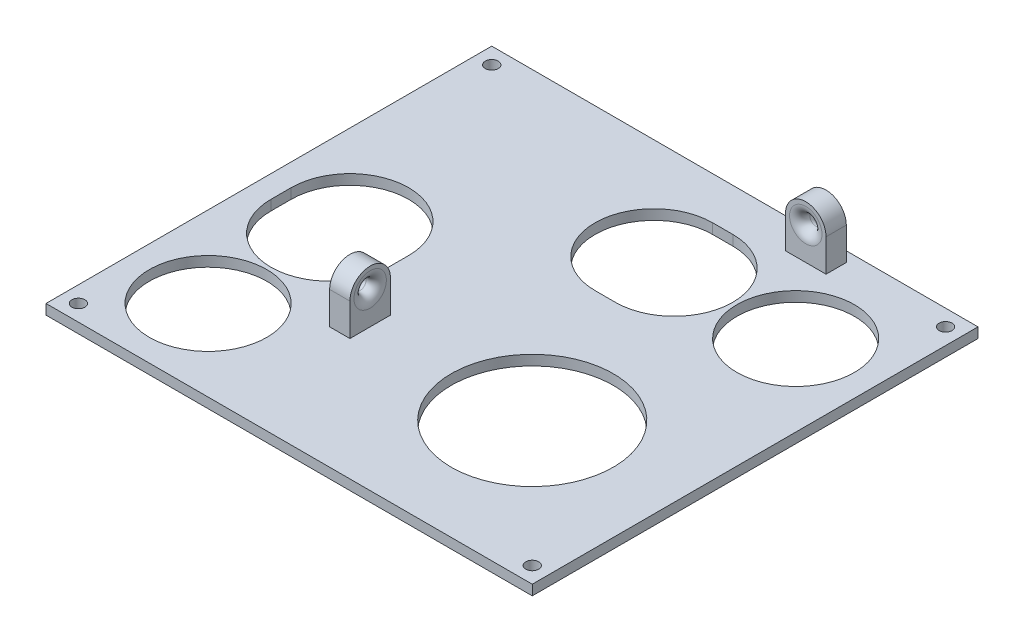
ISO-10303-21;
HEADER;
FILE_DESCRIPTION(('STEP AP214'),'2;1');
FILE_NAME('part.step','',(''),(''),'','','');
FILE_SCHEMA(('AUTOMOTIVE_DESIGN { 1 0 10303 214 1 1 1 1 }'));
ENDSEC;
DATA;
#1=APPLICATION_CONTEXT('core data for automotive mechanical design processes');
#2=APPLICATION_PROTOCOL_DEFINITION('international standard','automotive_design',2000,#1);
#3=PRODUCT_CONTEXT('',#1,'mechanical');
#4=PRODUCT('Part','Part','',(#3));
#5=PRODUCT_RELATED_PRODUCT_CATEGORY('part','',(#4));
#6=PRODUCT_DEFINITION_FORMATION('','',#4);
#7=PRODUCT_DEFINITION_CONTEXT('part definition',#1,'design');
#8=PRODUCT_DEFINITION('design','',#6,#7);
#9=PRODUCT_DEFINITION_SHAPE('','',#8);
#10=(LENGTH_UNIT() NAMED_UNIT(*) SI_UNIT(.MILLI.,.METRE.));
#11=(NAMED_UNIT(*) PLANE_ANGLE_UNIT() SI_UNIT($,.RADIAN.));
#12=(NAMED_UNIT(*) SI_UNIT($,.STERADIAN.) SOLID_ANGLE_UNIT());
#13=UNCERTAINTY_MEASURE_WITH_UNIT(LENGTH_MEASURE(1.E-05),#10,'distance_accuracy_value','');
#14=(GEOMETRIC_REPRESENTATION_CONTEXT(3) GLOBAL_UNCERTAINTY_ASSIGNED_CONTEXT((#13)) GLOBAL_UNIT_ASSIGNED_CONTEXT((#10,
#11,#12)) REPRESENTATION_CONTEXT('',''));
#15=CARTESIAN_POINT('',(0.,0.,0.));
#16=DIRECTION('',(0.,0.,1.));
#17=DIRECTION('',(1.,0.,0.));
#18=AXIS2_PLACEMENT_3D('',#15,#16,#17);
#19=CARTESIAN_POINT('',(-20.,16.5,15.));
#20=DIRECTION('',(0.,0.,1.));
#21=DIRECTION('',(1.,0.,0.));
#22=AXIS2_PLACEMENT_3D('',#19,#20,#21);
#23=PLANE('',#22);
#24=DIRECTION('',(1.,0.,0.));
#25=VECTOR('',#24,1.);
#26=CARTESIAN_POINT('',(-20.,10.5,15.));
#27=LINE('',#26,#25);
#28=CARTESIAN_POINT('',(-20.,10.5,15.));
#29=VERTEX_POINT('',#28);
#30=CARTESIAN_POINT('',(-15.,10.5,15.));
#31=VERTEX_POINT('',#30);
#32=EDGE_CURVE('E181',#29,#31,#27,.T.);
#33=ORIENTED_EDGE('',*,*,#32,.T.);
#34=DIRECTION('',(0.,-1.,0.));
#35=VECTOR('',#34,1.);
#36=CARTESIAN_POINT('',(-15.,16.5,15.));
#37=LINE('',#36,#35);
#38=CARTESIAN_POINT('',(-15.,2.5,15.));
#39=VERTEX_POINT('',#38);
#40=EDGE_CURVE('E204',#31,#39,#37,.T.);
#41=ORIENTED_EDGE('',*,*,#40,.T.);
#42=DIRECTION('',(-1.,0.,0.));
#43=VECTOR('',#42,1.);
#44=CARTESIAN_POINT('',(-20.,2.5,15.));
#45=LINE('',#44,#43);
#46=CARTESIAN_POINT('',(-20.,2.5,15.));
#47=VERTEX_POINT('',#46);
#48=EDGE_CURVE('E201',#39,#47,#45,.T.);
#49=ORIENTED_EDGE('',*,*,#48,.T.);
#50=DIRECTION('',(0.,-1.,0.));
#51=VECTOR('',#50,1.);
#52=CARTESIAN_POINT('',(-20.,16.5,15.));
#53=LINE('',#52,#51);
#54=EDGE_CURVE('E195',#29,#47,#53,.T.);
#55=ORIENTED_EDGE('',*,*,#54,.F.);
#56=EDGE_LOOP('',(#33,#41,#49,#55));
#57=FACE_BOUND('',#56,.T.);
#58=ADVANCED_FACE('F43',(#57),#23,.F.);
#59=CARTESIAN_POINT('',(30.,16.5,-52.5));
#60=DIRECTION('',(-1.,0.,0.));
#61=DIRECTION('',(0.,0.,1.));
#62=AXIS2_PLACEMENT_3D('',#59,#60,#61);
#63=PLANE('',#62);
#64=DIRECTION('',(0.,0.,1.));
#65=VECTOR('',#64,1.);
#66=CARTESIAN_POINT('',(30.,10.5,-55.));
#67=LINE('',#66,#65);
#68=CARTESIAN_POINT('',(30.,10.5,-52.5));
#69=VERTEX_POINT('',#68);
#70=CARTESIAN_POINT('',(30.,10.5,-47.5));
#71=VERTEX_POINT('',#70);
#72=EDGE_CURVE('E613',#69,#71,#67,.T.);
#73=ORIENTED_EDGE('',*,*,#72,.T.);
#74=DIRECTION('',(0.,-1.,0.));
#75=VECTOR('',#74,1.);
#76=CARTESIAN_POINT('',(30.,16.5,-47.5));
#77=LINE('',#76,#75);
#78=CARTESIAN_POINT('',(30.,2.5,-47.5));
#79=VERTEX_POINT('',#78);
#80=EDGE_CURVE('E551',#71,#79,#77,.T.);
#81=ORIENTED_EDGE('',*,*,#80,.T.);
#82=DIRECTION('',(0.,0.,-1.));
#83=VECTOR('',#82,1.);
#84=CARTESIAN_POINT('',(30.,2.5,-52.5));
#85=LINE('',#84,#83);
#86=CARTESIAN_POINT('',(30.,2.5,-52.5));
#87=VERTEX_POINT('',#86);
#88=EDGE_CURVE('E599',#79,#87,#85,.T.);
#89=ORIENTED_EDGE('',*,*,#88,.T.);
#90=DIRECTION('',(0.,-1.,0.));
#91=VECTOR('',#90,1.);
#92=CARTESIAN_POINT('',(30.,16.5,-52.5));
#93=LINE('',#92,#91);
#94=EDGE_CURVE('E572',#69,#87,#93,.T.);
#95=ORIENTED_EDGE('',*,*,#94,.F.);
#96=EDGE_LOOP('',(#73,#81,#89,#95));
#97=FACE_BOUND('',#96,.T.);
#98=ADVANCED_FACE('F436',(#97),#63,.F.);
#99=CARTESIAN_POINT('',(0.,2.5,0.));
#100=DIRECTION('',(0.,1.,0.));
#101=DIRECTION('',(0.,0.,1.));
#102=AXIS2_PLACEMENT_3D('',#99,#100,#101);
#103=PLANE('',#102);
#104=DIRECTION('',(0.,0.,1.));
#105=VECTOR('',#104,1.);
#106=CARTESIAN_POINT('',(-54.5,2.5,5.));
#107=LINE('',#106,#105);
#108=CARTESIAN_POINT('',(-54.5,2.5,0.));
#109=VERTEX_POINT('',#108);
#110=CARTESIAN_POINT('',(-54.5,2.5,5.));
#111=VERTEX_POINT('',#110);
#112=EDGE_CURVE('E224',#109,#111,#107,.T.);
#113=ORIENTED_EDGE('',*,*,#112,.F.);
#114=CARTESIAN_POINT('',(-40.,2.5,0.));
#115=DIRECTION('',(0.,1.,0.));
#116=DIRECTION('',(0.,0.,1.));
#117=AXIS2_PLACEMENT_3D('',#114,#115,#116);
#118=CIRCLE('',#117,14.5);
#119=CARTESIAN_POINT('',(-25.5,2.5,0.));
#120=VERTEX_POINT('',#119);
#121=EDGE_CURVE('E220',#120,#109,#118,.T.);
#122=ORIENTED_EDGE('',*,*,#121,.F.);
#123=DIRECTION('',(0.,0.,-1.));
#124=VECTOR('',#123,1.);
#125=CARTESIAN_POINT('',(-25.5,2.5,5.));
#126=LINE('',#125,#124);
#127=CARTESIAN_POINT('',(-25.5,2.5,5.));
#128=VERTEX_POINT('',#127);
#129=EDGE_CURVE('E216',#128,#120,#126,.T.);
#130=ORIENTED_EDGE('',*,*,#129,.F.);
#131=CARTESIAN_POINT('',(-40.,2.5,5.));
#132=DIRECTION('',(0.,1.,0.));
#133=DIRECTION('',(0.,0.,1.));
#134=AXIS2_PLACEMENT_3D('',#131,#132,#133);
#135=CIRCLE('',#134,14.5);
#136=EDGE_CURVE('E296',#111,#128,#135,.T.);
#137=ORIENTED_EDGE('',*,*,#136,.F.);
#138=EDGE_LOOP('',(#113,#122,#130,#137));
#139=FACE_BOUND('',#138,.T.);
#140=DIRECTION('',(1.,0.,0.));
#141=VECTOR('',#140,1.);
#142=CARTESIAN_POINT('',(10.,2.5,-15.5));
#143=LINE('',#142,#141);
#144=CARTESIAN_POINT('',(5.,2.5,-15.5));
#145=VERTEX_POINT('',#144);
#146=CARTESIAN_POINT('',(10.,2.5,-15.5));
#147=VERTEX_POINT('',#146);
#148=EDGE_CURVE('E241',#145,#147,#143,.T.);
#149=ORIENTED_EDGE('',*,*,#148,.F.);
#150=CARTESIAN_POINT('',(4.99999999999999,2.5,-30.));
#151=DIRECTION('',(0.,1.,0.));
#152=DIRECTION('',(0.,0.,1.));
#153=AXIS2_PLACEMENT_3D('',#150,#151,#152);
#154=CIRCLE('',#153,14.5);
#155=CARTESIAN_POINT('',(5.,2.5,-44.5));
#156=VERTEX_POINT('',#155);
#157=EDGE_CURVE('E237',#156,#145,#154,.T.);
#158=ORIENTED_EDGE('',*,*,#157,.F.);
#159=DIRECTION('',(-1.,0.,0.));
#160=VECTOR('',#159,1.);
#161=CARTESIAN_POINT('',(9.99999999999999,2.5,-44.5));
#162=LINE('',#161,#160);
#163=CARTESIAN_POINT('',(9.99999999999999,2.5,-44.5));
#164=VERTEX_POINT('',#163);
#165=EDGE_CURVE('E209',#164,#156,#162,.T.);
#166=ORIENTED_EDGE('',*,*,#165,.F.);
#167=CARTESIAN_POINT('',(9.99999999999999,2.5,-30.));
#168=DIRECTION('',(0.,1.,0.));
#169=DIRECTION('',(0.,0.,1.));
#170=AXIS2_PLACEMENT_3D('',#167,#168,#169);
#171=CIRCLE('',#170,14.5);
#172=EDGE_CURVE('E292',#147,#164,#171,.T.);
#173=ORIENTED_EDGE('',*,*,#172,.F.);
#174=EDGE_LOOP('',(#149,#158,#166,#173));
#175=FACE_BOUND('',#174,.T.);
#176=CARTESIAN_POINT('',(-56.,2.5,51.));
#177=DIRECTION('',(0.,1.,0.));
#178=DIRECTION('',(0.,0.,1.));
#179=AXIS2_PLACEMENT_3D('',#176,#177,#178);
#180=CIRCLE('',#179,1.60000000000001);
#181=CARTESIAN_POINT('',(-56.,2.5,52.6));
#182=VERTEX_POINT('',#181);
#183=EDGE_CURVE('E264',#182,#182,#180,.T.);
#184=ORIENTED_EDGE('',*,*,#183,.F.);
#185=EDGE_LOOP('',(#184));
#186=FACE_BOUND('',#185,.T.);
#187=CARTESIAN_POINT('',(56.,2.5,51.));
#188=DIRECTION('',(0.,1.,0.));
#189=DIRECTION('',(0.,0.,1.));
#190=AXIS2_PLACEMENT_3D('',#187,#188,#189);
#191=CIRCLE('',#190,1.60000000000001);
#192=CARTESIAN_POINT('',(56.,2.5,52.6));
#193=VERTEX_POINT('',#192);
#194=EDGE_CURVE('E270',#193,#193,#191,.T.);
#195=ORIENTED_EDGE('',*,*,#194,.F.);
#196=EDGE_LOOP('',(#195));
#197=FACE_BOUND('',#196,.T.);
#198=CARTESIAN_POINT('',(56.,2.5,-51.));
#199=DIRECTION('',(0.,1.,0.));
#200=DIRECTION('',(0.,0.,1.));
#201=AXIS2_PLACEMENT_3D('',#198,#199,#200);
#202=CIRCLE('',#201,1.60000000000001);
#203=CARTESIAN_POINT('',(56.,2.5,-49.4));
#204=VERTEX_POINT('',#203);
#205=EDGE_CURVE('E265',#204,#204,#202,.T.);
#206=ORIENTED_EDGE('',*,*,#205,.F.);
#207=EDGE_LOOP('',(#206));
#208=FACE_BOUND('',#207,.T.);
#209=CARTESIAN_POINT('',(-56.,2.5,-51.));
#210=DIRECTION('',(0.,1.,0.));
#211=DIRECTION('',(0.,0.,1.));
#212=AXIS2_PLACEMENT_3D('',#209,#210,#211);
#213=CIRCLE('',#212,1.60000000000001);
#214=CARTESIAN_POINT('',(-56.,2.5,-49.4));
#215=VERTEX_POINT('',#214);
#216=EDGE_CURVE('E269',#215,#215,#213,.T.);
#217=ORIENTED_EDGE('',*,*,#216,.F.);
#218=EDGE_LOOP('',(#217));
#219=FACE_BOUND('',#218,.T.);
#220=CARTESIAN_POINT('',(25.,2.5,20.));
#221=DIRECTION('',(0.,1.,0.));
#222=DIRECTION('',(0.,0.,1.));
#223=AXIS2_PLACEMENT_3D('',#220,#221,#222);
#224=CIRCLE('',#223,20.);
#225=CARTESIAN_POINT('',(25.,2.5,40.));
#226=VERTEX_POINT('',#225);
#227=EDGE_CURVE('E281',#226,#226,#224,.T.);
#228=ORIENTED_EDGE('',*,*,#227,.F.);
#229=EDGE_LOOP('',(#228));
#230=FACE_BOUND('',#229,.T.);
#231=CARTESIAN_POINT('',(40.,2.5,-30.));
#232=DIRECTION('',(0.,1.,0.));
#233=DIRECTION('',(0.,0.,1.));
#234=AXIS2_PLACEMENT_3D('',#231,#232,#233);
#235=CIRCLE('',#234,14.5);
#236=CARTESIAN_POINT('',(40.,2.5,-15.5));
#237=VERTEX_POINT('',#236);
#238=EDGE_CURVE('E287',#237,#237,#235,.T.);
#239=ORIENTED_EDGE('',*,*,#238,.F.);
#240=EDGE_LOOP('',(#239));
#241=FACE_BOUND('',#240,.T.);
#242=CARTESIAN_POINT('',(-40.,2.5,35.));
#243=DIRECTION('',(0.,1.,0.));
#244=DIRECTION('',(0.,0.,1.));
#245=AXIS2_PLACEMENT_3D('',#242,#243,#244);
#246=CIRCLE('',#245,14.5);
#247=CARTESIAN_POINT('',(-40.,2.5,49.5));
#248=VERTEX_POINT('',#247);
#249=EDGE_CURVE('E300',#248,#248,#246,.T.);
#250=ORIENTED_EDGE('',*,*,#249,.F.);
#251=EDGE_LOOP('',(#250));
#252=FACE_BOUND('',#251,.T.);
#253=DIRECTION('',(0.,0.,-1.));
#254=VECTOR('',#253,1.);
#255=CARTESIAN_POINT('',(60.,2.5,-55.));
#256=LINE('',#255,#254);
#257=CARTESIAN_POINT('',(60.,2.5,55.));
#258=VERTEX_POINT('',#257);
#259=CARTESIAN_POINT('',(60.,2.5,-55.));
#260=VERTEX_POINT('',#259);
#261=EDGE_CURVE('E304',#258,#260,#256,.T.);
#262=ORIENTED_EDGE('',*,*,#261,.T.);
#263=DIRECTION('',(-1.,0.,0.));
#264=VECTOR('',#263,1.);
#265=CARTESIAN_POINT('',(-60.,2.5,-55.));
#266=LINE('',#265,#264);
#267=CARTESIAN_POINT('',(-60.,2.5,-55.));
#268=VERTEX_POINT('',#267);
#269=EDGE_CURVE('E308',#260,#268,#266,.T.);
#270=ORIENTED_EDGE('',*,*,#269,.T.);
#271=DIRECTION('',(0.,0.,1.));
#272=VECTOR('',#271,1.);
#273=CARTESIAN_POINT('',(-60.,2.5,-55.));
#274=LINE('',#273,#272);
#275=CARTESIAN_POINT('',(-60.,2.5,55.));
#276=VERTEX_POINT('',#275);
#277=EDGE_CURVE('E312',#268,#276,#274,.T.);
#278=ORIENTED_EDGE('',*,*,#277,.T.);
#279=DIRECTION('',(1.,0.,0.));
#280=VECTOR('',#279,1.);
#281=CARTESIAN_POINT('',(-60.,2.5,55.));
#282=LINE('',#281,#280);
#283=EDGE_CURVE('E315',#276,#258,#282,.T.);
#284=ORIENTED_EDGE('',*,*,#283,.T.);
#285=EDGE_LOOP('',(#262,#270,#278,#284));
#286=FACE_BOUND('',#285,.T.);
#287=ORIENTED_EDGE('',*,*,#48,.F.);
#288=DIRECTION('',(0.,0.,-1.));
#289=VECTOR('',#288,1.);
#290=CARTESIAN_POINT('',(-15.,2.5,15.));
#291=LINE('',#290,#289);
#292=CARTESIAN_POINT('',(-15.,2.5,25.));
#293=VERTEX_POINT('',#292);
#294=EDGE_CURVE('E575',#293,#39,#291,.T.);
#295=ORIENTED_EDGE('',*,*,#294,.F.);
#296=DIRECTION('',(1.,0.,0.));
#297=VECTOR('',#296,1.);
#298=CARTESIAN_POINT('',(-20.,2.5,25.));
#299=LINE('',#298,#297);
#300=CARTESIAN_POINT('',(-20.,2.5,25.));
#301=VERTEX_POINT('',#300);
#302=EDGE_CURVE('E583',#301,#293,#299,.T.);
#303=ORIENTED_EDGE('',*,*,#302,.F.);
#304=DIRECTION('',(0.,0.,1.));
#305=VECTOR('',#304,1.);
#306=CARTESIAN_POINT('',(-20.,2.5,15.));
#307=LINE('',#306,#305);
#308=EDGE_CURVE('E580',#47,#301,#307,.T.);
#309=ORIENTED_EDGE('',*,*,#308,.F.);
#310=EDGE_LOOP('',(#287,#295,#303,#309));
#311=FACE_BOUND('',#310,.T.);
#312=DIRECTION('',(-1.,0.,0.));
#313=VECTOR('',#312,1.);
#314=CARTESIAN_POINT('',(20.,2.5,-52.5));
#315=LINE('',#314,#313);
#316=CARTESIAN_POINT('',(20.,2.5,-52.5));
#317=VERTEX_POINT('',#316);
#318=EDGE_CURVE('E598',#87,#317,#315,.T.);
#319=ORIENTED_EDGE('',*,*,#318,.F.);
#320=ORIENTED_EDGE('',*,*,#88,.F.);
#321=DIRECTION('',(1.,0.,0.));
#322=VECTOR('',#321,1.);
#323=CARTESIAN_POINT('',(20.,2.5,-47.5));
#324=LINE('',#323,#322);
#325=CARTESIAN_POINT('',(20.,2.5,-47.5));
#326=VERTEX_POINT('',#325);
#327=EDGE_CURVE('E555',#326,#79,#324,.T.);
#328=ORIENTED_EDGE('',*,*,#327,.F.);
#329=DIRECTION('',(0.,0.,1.));
#330=VECTOR('',#329,1.);
#331=CARTESIAN_POINT('',(20.,2.5,-52.5));
#332=LINE('',#331,#330);
#333=EDGE_CURVE('E567',#317,#326,#332,.T.);
#334=ORIENTED_EDGE('',*,*,#333,.F.);
#335=EDGE_LOOP('',(#319,#320,#328,#334));
#336=FACE_BOUND('',#335,.T.);
#337=ADVANCED_FACE('F441',(#139,#175,#186,#197,#208,#219,#230,#241,#252,#286,#311,#336),#103,.T.);
#338=CARTESIAN_POINT('',(-40.,-1.5,5.));
#339=DIRECTION('',(0.,1.,0.));
#340=DIRECTION('',(0.,0.,1.));
#341=AXIS2_PLACEMENT_3D('',#338,#339,#340);
#342=CYLINDRICAL_SURFACE('',#341,14.5);
#343=DIRECTION('',(0.,1.,0.));
#344=VECTOR('',#343,1.);
#345=CARTESIAN_POINT('',(-54.5,-1.5,5.));
#346=LINE('',#345,#344);
#347=CARTESIAN_POINT('',(-54.5,0.,5.));
#348=VERTEX_POINT('',#347);
#349=EDGE_CURVE('E389',#111,#348,#346,.F.);
#350=ORIENTED_EDGE('',*,*,#349,.F.);
#351=ORIENTED_EDGE('',*,*,#136,.T.);
#352=DIRECTION('',(0.,1.,0.));
#353=VECTOR('',#352,1.);
#354=CARTESIAN_POINT('',(-25.5,-1.5,5.));
#355=LINE('',#354,#353);
#356=CARTESIAN_POINT('',(-25.5,0.,5.));
#357=VERTEX_POINT('',#356);
#358=EDGE_CURVE('E385',#128,#357,#355,.F.);
#359=ORIENTED_EDGE('',*,*,#358,.T.);
#360=CARTESIAN_POINT('',(-40.,0.,5.));
#361=DIRECTION('',(0.,1.,0.));
#362=DIRECTION('',(0.,0.,1.));
#363=AXIS2_PLACEMENT_3D('',#360,#361,#362);
#364=CIRCLE('',#363,14.5);
#365=EDGE_CURVE('E351',#348,#357,#364,.T.);
#366=ORIENTED_EDGE('',*,*,#365,.F.);
#367=EDGE_LOOP('',(#350,#351,#359,#366));
#368=FACE_BOUND('',#367,.T.);
#369=ADVANCED_FACE('F504',(#368),#342,.F.);
#370=CARTESIAN_POINT('',(9.99999999999999,-1.5,-30.));
#371=DIRECTION('',(0.,1.,0.));
#372=DIRECTION('',(0.,0.,1.));
#373=AXIS2_PLACEMENT_3D('',#370,#371,#372);
#374=CYLINDRICAL_SURFACE('',#373,14.5);
#375=DIRECTION('',(0.,1.,0.));
#376=VECTOR('',#375,1.);
#377=CARTESIAN_POINT('',(9.99999999999999,-1.5,-15.5));
#378=LINE('',#377,#376);
#379=CARTESIAN_POINT('',(10.,0.,-15.5));
#380=VERTEX_POINT('',#379);
#381=EDGE_CURVE('E382',#147,#380,#378,.F.);
#382=ORIENTED_EDGE('',*,*,#381,.F.);
#383=ORIENTED_EDGE('',*,*,#172,.T.);
#384=DIRECTION('',(0.,1.,0.));
#385=VECTOR('',#384,1.);
#386=CARTESIAN_POINT('',(9.99999999999999,-1.5,-44.5));
#387=LINE('',#386,#385);
#388=CARTESIAN_POINT('',(9.99999999999999,0.,-44.5));
#389=VERTEX_POINT('',#388);
#390=EDGE_CURVE('E347',#164,#389,#387,.F.);
#391=ORIENTED_EDGE('',*,*,#390,.T.);
#392=CARTESIAN_POINT('',(9.99999999999999,0.,-30.));
#393=DIRECTION('',(0.,1.,0.));
#394=DIRECTION('',(0.,0.,1.));
#395=AXIS2_PLACEMENT_3D('',#392,#393,#394);
#396=CIRCLE('',#395,14.5);
#397=EDGE_CURVE('E355',#380,#389,#396,.T.);
#398=ORIENTED_EDGE('',*,*,#397,.F.);
#399=EDGE_LOOP('',(#382,#383,#391,#398));
#400=FACE_BOUND('',#399,.T.);
#401=ADVANCED_FACE('F500',(#400),#374,.F.);
#402=CARTESIAN_POINT('',(60.,2.5,-55.));
#403=DIRECTION('',(-1.,0.,0.));
#404=DIRECTION('',(0.,0.,1.));
#405=AXIS2_PLACEMENT_3D('',#402,#403,#404);
#406=PLANE('',#405);
#407=DIRECTION('',(0.,0.,-1.));
#408=VECTOR('',#407,1.);
#409=CARTESIAN_POINT('',(60.,0.,-55.));
#410=LINE('',#409,#408);
#411=CARTESIAN_POINT('',(60.,0.,55.));
#412=VERTEX_POINT('',#411);
#413=CARTESIAN_POINT('',(60.,0.,-55.));
#414=VERTEX_POINT('',#413);
#415=EDGE_CURVE('E319',#412,#414,#410,.T.);
#416=ORIENTED_EDGE('',*,*,#415,.T.);
#417=DIRECTION('',(0.,-1.,0.));
#418=VECTOR('',#417,1.);
#419=CARTESIAN_POINT('',(60.,2.5,-55.));
#420=LINE('',#419,#418);
#421=EDGE_CURVE('E343',#260,#414,#420,.T.);
#422=ORIENTED_EDGE('',*,*,#421,.F.);
#423=ORIENTED_EDGE('',*,*,#261,.F.);
#424=DIRECTION('',(0.,-1.,0.));
#425=VECTOR('',#424,1.);
#426=CARTESIAN_POINT('',(60.,2.5,55.));
#427=LINE('',#426,#425);
#428=EDGE_CURVE('E318',#258,#412,#427,.T.);
#429=ORIENTED_EDGE('',*,*,#428,.T.);
#430=EDGE_LOOP('',(#416,#422,#423,#429));
#431=FACE_BOUND('',#430,.T.);
#432=ADVANCED_FACE('F503',(#431),#406,.F.);
#433=CARTESIAN_POINT('',(-60.,2.5,-55.));
#434=DIRECTION('',(0.,0.,1.));
#435=DIRECTION('',(1.,0.,0.));
#436=AXIS2_PLACEMENT_3D('',#433,#434,#435);
#437=PLANE('',#436);
#438=DIRECTION('',(-1.,0.,0.));
#439=VECTOR('',#438,1.);
#440=CARTESIAN_POINT('',(-60.,0.,-55.));
#441=LINE('',#440,#439);
#442=CARTESIAN_POINT('',(-60.,0.,-55.));
#443=VERTEX_POINT('',#442);
#444=EDGE_CURVE('E323',#414,#443,#441,.T.);
#445=ORIENTED_EDGE('',*,*,#444,.T.);
#446=DIRECTION('',(0.,-1.,0.));
#447=VECTOR('',#446,1.);
#448=CARTESIAN_POINT('',(-60.,2.5,-55.));
#449=LINE('',#448,#447);
#450=EDGE_CURVE('E339',#268,#443,#449,.T.);
#451=ORIENTED_EDGE('',*,*,#450,.F.);
#452=ORIENTED_EDGE('',*,*,#269,.F.);
#453=ORIENTED_EDGE('',*,*,#421,.T.);
#454=EDGE_LOOP('',(#445,#451,#452,#453));
#455=FACE_BOUND('',#454,.T.);
#456=ADVANCED_FACE('F526',(#455),#437,.F.);
#457=CARTESIAN_POINT('',(-60.,2.5,-55.));
#458=DIRECTION('',(1.,0.,0.));
#459=DIRECTION('',(0.,0.,-1.));
#460=AXIS2_PLACEMENT_3D('',#457,#458,#459);
#461=PLANE('',#460);
#462=DIRECTION('',(0.,0.,1.));
#463=VECTOR('',#462,1.);
#464=CARTESIAN_POINT('',(-60.,0.,-55.));
#465=LINE('',#464,#463);
#466=CARTESIAN_POINT('',(-60.,0.,55.));
#467=VERTEX_POINT('',#466);
#468=EDGE_CURVE('E327',#443,#467,#465,.T.);
#469=ORIENTED_EDGE('',*,*,#468,.T.);
#470=DIRECTION('',(0.,-1.,0.));
#471=VECTOR('',#470,1.);
#472=CARTESIAN_POINT('',(-60.,2.5,55.));
#473=LINE('',#472,#471);
#474=EDGE_CURVE('E335',#276,#467,#473,.T.);
#475=ORIENTED_EDGE('',*,*,#474,.F.);
#476=ORIENTED_EDGE('',*,*,#277,.F.);
#477=ORIENTED_EDGE('',*,*,#450,.T.);
#478=EDGE_LOOP('',(#469,#475,#476,#477));
#479=FACE_BOUND('',#478,.T.);
#480=ADVANCED_FACE('F522',(#479),#461,.F.);
#481=CARTESIAN_POINT('',(-60.,2.5,55.));
#482=DIRECTION('',(0.,0.,-1.));
#483=DIRECTION('',(-1.,0.,0.));
#484=AXIS2_PLACEMENT_3D('',#481,#482,#483);
#485=PLANE('',#484);
#486=DIRECTION('',(1.,0.,0.));
#487=VECTOR('',#486,1.);
#488=CARTESIAN_POINT('',(-60.,0.,55.));
#489=LINE('',#488,#487);
#490=EDGE_CURVE('E309',#467,#412,#489,.T.);
#491=ORIENTED_EDGE('',*,*,#490,.T.);
#492=ORIENTED_EDGE('',*,*,#428,.F.);
#493=ORIENTED_EDGE('',*,*,#283,.F.);
#494=ORIENTED_EDGE('',*,*,#474,.T.);
#495=EDGE_LOOP('',(#491,#492,#493,#494));
#496=FACE_BOUND('',#495,.T.);
#497=ADVANCED_FACE('F518',(#496),#485,.F.);
#498=CARTESIAN_POINT('',(0.,0.,0.));
#499=DIRECTION('',(0.,1.,0.));
#500=DIRECTION('',(0.,0.,1.));
#501=AXIS2_PLACEMENT_3D('',#498,#499,#500);
#502=PLANE('',#501);
#503=CARTESIAN_POINT('',(-56.,0.,51.));
#504=DIRECTION('',(0.,1.,0.));
#505=DIRECTION('',(0.,0.,1.));
#506=AXIS2_PLACEMENT_3D('',#503,#504,#505);
#507=CIRCLE('',#506,1.60000000000001);
#508=CARTESIAN_POINT('',(-56.,0.,52.6));
#509=VERTEX_POINT('',#508);
#510=EDGE_CURVE('E286',#509,#509,#507,.T.);
#511=ORIENTED_EDGE('',*,*,#510,.T.);
#512=EDGE_LOOP('',(#511));
#513=FACE_BOUND('',#512,.T.);
#514=CARTESIAN_POINT('',(56.,0.,51.));
#515=DIRECTION('',(0.,1.,0.));
#516=DIRECTION('',(0.,0.,1.));
#517=AXIS2_PLACEMENT_3D('',#514,#515,#516);
#518=CIRCLE('',#517,1.60000000000001);
#519=CARTESIAN_POINT('',(56.,0.,52.6));
#520=VERTEX_POINT('',#519);
#521=EDGE_CURVE('E372',#520,#520,#518,.T.);
#522=ORIENTED_EDGE('',*,*,#521,.T.);
#523=EDGE_LOOP('',(#522));
#524=FACE_BOUND('',#523,.T.);
#525=CARTESIAN_POINT('',(56.,0.,-51.));
#526=DIRECTION('',(0.,1.,0.));
#527=DIRECTION('',(0.,0.,1.));
#528=AXIS2_PLACEMENT_3D('',#525,#526,#527);
#529=CIRCLE('',#528,1.60000000000001);
#530=CARTESIAN_POINT('',(56.,0.,-49.4));
#531=VERTEX_POINT('',#530);
#532=EDGE_CURVE('E368',#531,#531,#529,.T.);
#533=ORIENTED_EDGE('',*,*,#532,.T.);
#534=EDGE_LOOP('',(#533));
#535=FACE_BOUND('',#534,.T.);
#536=CARTESIAN_POINT('',(-56.,0.,-51.));
#537=DIRECTION('',(0.,1.,0.));
#538=DIRECTION('',(0.,0.,1.));
#539=AXIS2_PLACEMENT_3D('',#536,#537,#538);
#540=CIRCLE('',#539,1.60000000000001);
#541=CARTESIAN_POINT('',(-56.,0.,-49.4));
#542=VERTEX_POINT('',#541);
#543=EDGE_CURVE('E280',#542,#542,#540,.T.);
#544=ORIENTED_EDGE('',*,*,#543,.T.);
#545=EDGE_LOOP('',(#544));
#546=FACE_BOUND('',#545,.T.);
#547=CARTESIAN_POINT('',(25.,0.,20.));
#548=DIRECTION('',(0.,1.,0.));
#549=DIRECTION('',(0.,0.,1.));
#550=AXIS2_PLACEMENT_3D('',#547,#548,#549);
#551=CIRCLE('',#550,20.);
#552=CARTESIAN_POINT('',(25.,0.,40.));
#553=VERTEX_POINT('',#552);
#554=EDGE_CURVE('E285',#553,#553,#551,.T.);
#555=ORIENTED_EDGE('',*,*,#554,.T.);
#556=EDGE_LOOP('',(#555));
#557=FACE_BOUND('',#556,.T.);
#558=CARTESIAN_POINT('',(40.,0.,-30.));
#559=DIRECTION('',(0.,1.,0.));
#560=DIRECTION('',(0.,0.,1.));
#561=AXIS2_PLACEMENT_3D('',#558,#559,#560);
#562=CIRCLE('',#561,14.5);
#563=CARTESIAN_POINT('',(40.,0.,-15.5));
#564=VERTEX_POINT('',#563);
#565=EDGE_CURVE('E324',#564,#564,#562,.T.);
#566=ORIENTED_EDGE('',*,*,#565,.T.);
#567=EDGE_LOOP('',(#566));
#568=FACE_BOUND('',#567,.T.);
#569=CARTESIAN_POINT('',(4.99999999999999,0.,-30.));
#570=DIRECTION('',(0.,1.,0.));
#571=DIRECTION('',(0.,0.,1.));
#572=AXIS2_PLACEMENT_3D('',#569,#570,#571);
#573=CIRCLE('',#572,14.5);
#574=CARTESIAN_POINT('',(5.,0.,-44.5));
#575=VERTEX_POINT('',#574);
#576=CARTESIAN_POINT('',(5.,0.,-15.5));
#577=VERTEX_POINT('',#576);
#578=EDGE_CURVE('E392',#575,#577,#573,.T.);
#579=ORIENTED_EDGE('',*,*,#578,.T.);
#580=DIRECTION('',(1.,0.,0.));
#581=VECTOR('',#580,1.);
#582=CARTESIAN_POINT('',(0.,0.,-15.5));
#583=LINE('',#582,#581);
#584=EDGE_CURVE('E252',#577,#380,#583,.T.);
#585=ORIENTED_EDGE('',*,*,#584,.T.);
#586=ORIENTED_EDGE('',*,*,#397,.T.);
#587=DIRECTION('',(-1.,0.,0.));
#588=VECTOR('',#587,1.);
#589=CARTESIAN_POINT('',(0.,0.,-44.5));
#590=LINE('',#589,#588);
#591=EDGE_CURVE('E231',#389,#575,#590,.T.);
#592=ORIENTED_EDGE('',*,*,#591,.T.);
#593=EDGE_LOOP('',(#579,#585,#586,#592));
#594=FACE_BOUND('',#593,.T.);
#595=CARTESIAN_POINT('',(-40.,0.,0.));
#596=DIRECTION('',(0.,1.,0.));
#597=DIRECTION('',(0.,0.,1.));
#598=AXIS2_PLACEMENT_3D('',#595,#596,#597);
#599=CIRCLE('',#598,14.5);
#600=CARTESIAN_POINT('',(-25.5,0.,0.));
#601=VERTEX_POINT('',#600);
#602=CARTESIAN_POINT('',(-54.5,0.,0.));
#603=VERTEX_POINT('',#602);
#604=EDGE_CURVE('E396',#601,#603,#599,.T.);
#605=ORIENTED_EDGE('',*,*,#604,.T.);
#606=DIRECTION('',(0.,0.,1.));
#607=VECTOR('',#606,1.);
#608=CARTESIAN_POINT('',(-54.5,0.,0.));
#609=LINE('',#608,#607);
#610=EDGE_CURVE('E260',#603,#348,#609,.T.);
#611=ORIENTED_EDGE('',*,*,#610,.T.);
#612=ORIENTED_EDGE('',*,*,#365,.T.);
#613=DIRECTION('',(0.,0.,-1.));
#614=VECTOR('',#613,1.);
#615=CARTESIAN_POINT('',(-25.5,0.,0.));
#616=LINE('',#615,#614);
#617=EDGE_CURVE('E256',#357,#601,#616,.T.);
#618=ORIENTED_EDGE('',*,*,#617,.T.);
#619=EDGE_LOOP('',(#605,#611,#612,#618));
#620=FACE_BOUND('',#619,.T.);
#621=CARTESIAN_POINT('',(-40.,0.,35.));
#622=DIRECTION('',(0.,1.,0.));
#623=DIRECTION('',(0.,0.,1.));
#624=AXIS2_PLACEMENT_3D('',#621,#622,#623);
#625=CIRCLE('',#624,14.5);
#626=CARTESIAN_POINT('',(-40.,0.,49.5));
#627=VERTEX_POINT('',#626);
#628=EDGE_CURVE('E291',#627,#627,#625,.T.);
#629=ORIENTED_EDGE('',*,*,#628,.T.);
#630=EDGE_LOOP('',(#629));
#631=FACE_BOUND('',#630,.T.);
#632=ORIENTED_EDGE('',*,*,#415,.F.);
#633=ORIENTED_EDGE('',*,*,#490,.F.);
#634=ORIENTED_EDGE('',*,*,#468,.F.);
#635=ORIENTED_EDGE('',*,*,#444,.F.);
#636=EDGE_LOOP('',(#632,#633,#634,#635));
#637=FACE_BOUND('',#636,.T.);
#638=ADVANCED_FACE('F511',(#513,#524,#535,#546,#557,#568,#594,#620,#631,#637),#502,.F.);
#639=CARTESIAN_POINT('',(-40.,-1.5,35.));
#640=DIRECTION('',(0.,1.,0.));
#641=DIRECTION('',(0.,0.,1.));
#642=AXIS2_PLACEMENT_3D('',#639,#640,#641);
#643=CYLINDRICAL_SURFACE('',#642,14.5);
#644=ORIENTED_EDGE('',*,*,#249,.T.);
#645=EDGE_LOOP('',(#644));
#646=FACE_BOUND('',#645,.T.);
#647=ORIENTED_EDGE('',*,*,#628,.F.);
#648=EDGE_LOOP('',(#647));
#649=FACE_BOUND('',#648,.T.);
#650=ADVANCED_FACE('F498',(#646,#649),#643,.F.);
#651=CARTESIAN_POINT('',(40.,-1.5,-30.));
#652=DIRECTION('',(0.,1.,0.));
#653=DIRECTION('',(0.,0.,1.));
#654=AXIS2_PLACEMENT_3D('',#651,#652,#653);
#655=CYLINDRICAL_SURFACE('',#654,14.5);
#656=ORIENTED_EDGE('',*,*,#238,.T.);
#657=EDGE_LOOP('',(#656));
#658=FACE_BOUND('',#657,.T.);
#659=ORIENTED_EDGE('',*,*,#565,.F.);
#660=EDGE_LOOP('',(#659));
#661=FACE_BOUND('',#660,.T.);
#662=ADVANCED_FACE('F494',(#658,#661),#655,.F.);
#663=CARTESIAN_POINT('',(25.,-7.5,20.));
#664=DIRECTION('',(0.,1.,0.));
#665=DIRECTION('',(0.,0.,1.));
#666=AXIS2_PLACEMENT_3D('',#663,#664,#665);
#667=CYLINDRICAL_SURFACE('',#666,20.);
#668=ORIENTED_EDGE('',*,*,#227,.T.);
#669=EDGE_LOOP('',(#668));
#670=FACE_BOUND('',#669,.T.);
#671=ORIENTED_EDGE('',*,*,#554,.F.);
#672=EDGE_LOOP('',(#671));
#673=FACE_BOUND('',#672,.T.);
#674=ADVANCED_FACE('F490',(#670,#673),#667,.F.);
#675=CARTESIAN_POINT('',(-56.,-7.5,-51.));
#676=DIRECTION('',(0.,1.,0.));
#677=DIRECTION('',(0.,0.,1.));
#678=AXIS2_PLACEMENT_3D('',#675,#676,#677);
#679=CYLINDRICAL_SURFACE('',#678,1.60000000000001);
#680=ORIENTED_EDGE('',*,*,#216,.T.);
#681=EDGE_LOOP('',(#680));
#682=FACE_BOUND('',#681,.T.);
#683=ORIENTED_EDGE('',*,*,#543,.F.);
#684=EDGE_LOOP('',(#683));
#685=FACE_BOUND('',#684,.T.);
#686=ADVANCED_FACE('F480',(#682,#685),#679,.F.);
#687=CARTESIAN_POINT('',(56.,-7.5,-51.));
#688=DIRECTION('',(0.,1.,0.));
#689=DIRECTION('',(0.,0.,1.));
#690=AXIS2_PLACEMENT_3D('',#687,#688,#689);
#691=CYLINDRICAL_SURFACE('',#690,1.60000000000001);
#692=ORIENTED_EDGE('',*,*,#205,.T.);
#693=EDGE_LOOP('',(#692));
#694=FACE_BOUND('',#693,.T.);
#695=ORIENTED_EDGE('',*,*,#532,.F.);
#696=EDGE_LOOP('',(#695));
#697=FACE_BOUND('',#696,.T.);
#698=ADVANCED_FACE('F476',(#694,#697),#691,.F.);
#699=CARTESIAN_POINT('',(56.,-7.5,51.));
#700=DIRECTION('',(0.,1.,0.));
#701=DIRECTION('',(0.,0.,1.));
#702=AXIS2_PLACEMENT_3D('',#699,#700,#701);
#703=CYLINDRICAL_SURFACE('',#702,1.60000000000001);
#704=ORIENTED_EDGE('',*,*,#194,.T.);
#705=EDGE_LOOP('',(#704));
#706=FACE_BOUND('',#705,.T.);
#707=ORIENTED_EDGE('',*,*,#521,.F.);
#708=EDGE_LOOP('',(#707));
#709=FACE_BOUND('',#708,.T.);
#710=ADVANCED_FACE('F479',(#706,#709),#703,.F.);
#711=CARTESIAN_POINT('',(-56.,-7.5,51.));
#712=DIRECTION('',(0.,1.,0.));
#713=DIRECTION('',(0.,0.,1.));
#714=AXIS2_PLACEMENT_3D('',#711,#712,#713);
#715=CYLINDRICAL_SURFACE('',#714,1.60000000000001);
#716=ORIENTED_EDGE('',*,*,#183,.T.);
#717=EDGE_LOOP('',(#716));
#718=FACE_BOUND('',#717,.T.);
#719=ORIENTED_EDGE('',*,*,#510,.F.);
#720=EDGE_LOOP('',(#719));
#721=FACE_BOUND('',#720,.T.);
#722=ADVANCED_FACE('F471',(#718,#721),#715,.F.);
#723=CARTESIAN_POINT('',(4.99999999999999,-7.5,-30.));
#724=DIRECTION('',(0.,1.,0.));
#725=DIRECTION('',(0.,0.,1.));
#726=AXIS2_PLACEMENT_3D('',#723,#724,#725);
#727=CYLINDRICAL_SURFACE('',#726,14.5);
#728=DIRECTION('',(0.,1.,0.));
#729=VECTOR('',#728,1.);
#730=CARTESIAN_POINT('',(5.,-7.5,-44.5));
#731=LINE('',#730,#729);
#732=EDGE_CURVE('E244',#575,#156,#731,.T.);
#733=ORIENTED_EDGE('',*,*,#732,.T.);
#734=ORIENTED_EDGE('',*,*,#157,.T.);
#735=DIRECTION('',(0.,1.,0.));
#736=VECTOR('',#735,1.);
#737=CARTESIAN_POINT('',(5.,-7.5,-15.5));
#738=LINE('',#737,#736);
#739=EDGE_CURVE('E221',#577,#145,#738,.T.);
#740=ORIENTED_EDGE('',*,*,#739,.F.);
#741=ORIENTED_EDGE('',*,*,#578,.F.);
#742=EDGE_LOOP('',(#733,#734,#740,#741));
#743=FACE_BOUND('',#742,.T.);
#744=ADVANCED_FACE('F467',(#743),#727,.F.);
#745=CARTESIAN_POINT('',(10.,-7.5,-15.5));
#746=DIRECTION('',(0.,0.,1.));
#747=DIRECTION('',(1.,0.,0.));
#748=AXIS2_PLACEMENT_3D('',#745,#746,#747);
#749=PLANE('',#748);
#750=ORIENTED_EDGE('',*,*,#739,.T.);
#751=ORIENTED_EDGE('',*,*,#148,.T.);
#752=ORIENTED_EDGE('',*,*,#381,.T.);
#753=ORIENTED_EDGE('',*,*,#584,.F.);
#754=EDGE_LOOP('',(#750,#751,#752,#753));
#755=FACE_BOUND('',#754,.T.);
#756=ADVANCED_FACE('F464',(#755),#749,.F.);
#757=CARTESIAN_POINT('',(9.99999999999999,-7.5,-44.5));
#758=DIRECTION('',(0.,0.,-1.));
#759=DIRECTION('',(-1.,0.,0.));
#760=AXIS2_PLACEMENT_3D('',#757,#758,#759);
#761=PLANE('',#760);
#762=ORIENTED_EDGE('',*,*,#390,.F.);
#763=ORIENTED_EDGE('',*,*,#165,.T.);
#764=ORIENTED_EDGE('',*,*,#732,.F.);
#765=ORIENTED_EDGE('',*,*,#591,.F.);
#766=EDGE_LOOP('',(#762,#763,#764,#765));
#767=FACE_BOUND('',#766,.T.);
#768=ADVANCED_FACE('F459',(#767),#761,.F.);
#769=CARTESIAN_POINT('',(-40.,-7.5,0.));
#770=DIRECTION('',(0.,1.,0.));
#771=DIRECTION('',(0.,0.,1.));
#772=AXIS2_PLACEMENT_3D('',#769,#770,#771);
#773=CYLINDRICAL_SURFACE('',#772,14.5);
#774=DIRECTION('',(0.,1.,0.));
#775=VECTOR('',#774,1.);
#776=CARTESIAN_POINT('',(-25.5,-7.5,0.));
#777=LINE('',#776,#775);
#778=EDGE_CURVE('E227',#601,#120,#777,.T.);
#779=ORIENTED_EDGE('',*,*,#778,.T.);
#780=ORIENTED_EDGE('',*,*,#121,.T.);
#781=DIRECTION('',(0.,1.,0.));
#782=VECTOR('',#781,1.);
#783=CARTESIAN_POINT('',(-54.5,-7.5,0.));
#784=LINE('',#783,#782);
#785=EDGE_CURVE('E228',#603,#109,#784,.T.);
#786=ORIENTED_EDGE('',*,*,#785,.F.);
#787=ORIENTED_EDGE('',*,*,#604,.F.);
#788=EDGE_LOOP('',(#779,#780,#786,#787));
#789=FACE_BOUND('',#788,.T.);
#790=ADVANCED_FACE('F455',(#789),#773,.F.);
#791=CARTESIAN_POINT('',(-54.5,-7.5,5.));
#792=DIRECTION('',(-1.,0.,0.));
#793=DIRECTION('',(0.,0.,1.));
#794=AXIS2_PLACEMENT_3D('',#791,#792,#793);
#795=PLANE('',#794);
#796=ORIENTED_EDGE('',*,*,#785,.T.);
#797=ORIENTED_EDGE('',*,*,#112,.T.);
#798=ORIENTED_EDGE('',*,*,#349,.T.);
#799=ORIENTED_EDGE('',*,*,#610,.F.);
#800=EDGE_LOOP('',(#796,#797,#798,#799));
#801=FACE_BOUND('',#800,.T.);
#802=ADVANCED_FACE('F452',(#801),#795,.F.);
#803=CARTESIAN_POINT('',(-25.5,-7.5,5.));
#804=DIRECTION('',(1.,0.,0.));
#805=DIRECTION('',(0.,0.,-1.));
#806=AXIS2_PLACEMENT_3D('',#803,#804,#805);
#807=PLANE('',#806);
#808=ORIENTED_EDGE('',*,*,#358,.F.);
#809=ORIENTED_EDGE('',*,*,#129,.T.);
#810=ORIENTED_EDGE('',*,*,#778,.F.);
#811=ORIENTED_EDGE('',*,*,#617,.F.);
#812=EDGE_LOOP('',(#808,#809,#810,#811));
#813=FACE_BOUND('',#812,.T.);
#814=ADVANCED_FACE('F450',(#813),#807,.F.);
#815=CARTESIAN_POINT('',(-15.,16.5,15.));
#816=DIRECTION('',(-1.,0.,0.));
#817=DIRECTION('',(0.,0.,1.));
#818=AXIS2_PLACEMENT_3D('',#815,#816,#817);
#819=PLANE('',#818);
#820=CARTESIAN_POINT('',(-15.,10.5,20.));
#821=DIRECTION('',(-1.,0.,0.));
#822=DIRECTION('',(0.,0.,1.));
#823=AXIS2_PLACEMENT_3D('',#820,#821,#822);
#824=CIRCLE('',#823,4.);
#825=CARTESIAN_POINT('',(-15.,10.5,24.));
#826=VERTEX_POINT('',#825);
#827=EDGE_CURVE('E11',#826,#826,#824,.T.);
#828=ORIENTED_EDGE('',*,*,#827,.T.);
#829=EDGE_LOOP('',(#828));
#830=FACE_BOUND('',#829,.T.);
#831=ORIENTED_EDGE('',*,*,#40,.F.);
#832=CARTESIAN_POINT('',(-15.,10.5,20.));
#833=DIRECTION('',(-1.,0.,0.));
#834=DIRECTION('',(0.,0.,1.));
#835=AXIS2_PLACEMENT_3D('',#832,#833,#834);
#836=CIRCLE('',#835,4.99999999999999);
#837=CARTESIAN_POINT('',(-15.,10.5,25.));
#838=VERTEX_POINT('',#837);
#839=EDGE_CURVE('E184',#838,#31,#836,.T.);
#840=ORIENTED_EDGE('',*,*,#839,.F.);
#841=DIRECTION('',(0.,-1.,0.));
#842=VECTOR('',#841,1.);
#843=CARTESIAN_POINT('',(-15.,16.5,25.));
#844=LINE('',#843,#842);
#845=EDGE_CURVE('E212',#838,#293,#844,.T.);
#846=ORIENTED_EDGE('',*,*,#845,.T.);
#847=ORIENTED_EDGE('',*,*,#294,.T.);
#848=EDGE_LOOP('',(#831,#840,#846,#847));
#849=FACE_BOUND('',#848,.T.);
#850=ADVANCED_FACE('F447',(#830,#849),#819,.F.);
#851=CARTESIAN_POINT('',(-20.,16.5,15.));
#852=DIRECTION('',(1.,0.,0.));
#853=DIRECTION('',(0.,0.,-1.));
#854=AXIS2_PLACEMENT_3D('',#851,#852,#853);
#855=PLANE('',#854);
#856=CARTESIAN_POINT('',(-20.,10.5,20.));
#857=DIRECTION('',(1.,0.,0.));
#858=DIRECTION('',(0.,0.,-1.));
#859=AXIS2_PLACEMENT_3D('',#856,#857,#858);
#860=CIRCLE('',#859,4.);
#861=CARTESIAN_POINT('',(-20.,10.5,16.));
#862=VERTEX_POINT('',#861);
#863=EDGE_CURVE('E53',#862,#862,#860,.T.);
#864=ORIENTED_EDGE('',*,*,#863,.T.);
#865=EDGE_LOOP('',(#864));
#866=FACE_BOUND('',#865,.T.);
#867=DIRECTION('',(0.,-1.,0.));
#868=VECTOR('',#867,1.);
#869=CARTESIAN_POINT('',(-20.,16.5,25.));
#870=LINE('',#869,#868);
#871=CARTESIAN_POINT('',(-20.,10.5,25.));
#872=VERTEX_POINT('',#871);
#873=EDGE_CURVE('E197',#872,#301,#870,.T.);
#874=ORIENTED_EDGE('',*,*,#873,.F.);
#875=CARTESIAN_POINT('',(-20.,10.5,20.));
#876=DIRECTION('',(-1.,0.,0.));
#877=DIRECTION('',(0.,0.,1.));
#878=AXIS2_PLACEMENT_3D('',#875,#876,#877);
#879=CIRCLE('',#878,4.99999999999999);
#880=EDGE_CURVE('E61',#872,#29,#879,.T.);
#881=ORIENTED_EDGE('',*,*,#880,.T.);
#882=ORIENTED_EDGE('',*,*,#54,.T.);
#883=ORIENTED_EDGE('',*,*,#308,.T.);
#884=EDGE_LOOP('',(#874,#881,#882,#883));
#885=FACE_BOUND('',#884,.T.);
#886=ADVANCED_FACE('F193',(#866,#885),#855,.F.);
#887=CARTESIAN_POINT('',(-20.,16.5,25.));
#888=DIRECTION('',(0.,0.,-1.));
#889=DIRECTION('',(-1.,0.,0.));
#890=AXIS2_PLACEMENT_3D('',#887,#888,#889);
#891=PLANE('',#890);
#892=ORIENTED_EDGE('',*,*,#845,.F.);
#893=DIRECTION('',(1.,0.,0.));
#894=VECTOR('',#893,1.);
#895=CARTESIAN_POINT('',(-20.,10.5,25.));
#896=LINE('',#895,#894);
#897=EDGE_CURVE('E189',#872,#838,#896,.T.);
#898=ORIENTED_EDGE('',*,*,#897,.F.);
#899=ORIENTED_EDGE('',*,*,#873,.T.);
#900=ORIENTED_EDGE('',*,*,#302,.T.);
#901=EDGE_LOOP('',(#892,#898,#899,#900));
#902=FACE_BOUND('',#901,.T.);
#903=ADVANCED_FACE('F592',(#902),#891,.F.);
#904=CARTESIAN_POINT('',(20.,16.5,-52.5));
#905=DIRECTION('',(0.,0.,1.));
#906=DIRECTION('',(1.,0.,0.));
#907=AXIS2_PLACEMENT_3D('',#904,#905,#906);
#908=PLANE('',#907);
#909=CARTESIAN_POINT('',(25.,10.5,-52.5));
#910=DIRECTION('',(0.,0.,1.));
#911=DIRECTION('',(1.,0.,0.));
#912=AXIS2_PLACEMENT_3D('',#909,#910,#911);
#913=CIRCLE('',#912,4.00000000000001);
#914=CARTESIAN_POINT('',(29.,10.5,-52.5));
#915=VERTEX_POINT('',#914);
#916=EDGE_CURVE('E400',#915,#915,#913,.T.);
#917=ORIENTED_EDGE('',*,*,#916,.T.);
#918=EDGE_LOOP('',(#917));
#919=FACE_BOUND('',#918,.T.);
#920=DIRECTION('',(0.,-1.,0.));
#921=VECTOR('',#920,1.);
#922=CARTESIAN_POINT('',(20.,16.5,-52.5));
#923=LINE('',#922,#921);
#924=CARTESIAN_POINT('',(20.,10.5,-52.5));
#925=VERTEX_POINT('',#924);
#926=EDGE_CURVE('E564',#925,#317,#923,.T.);
#927=ORIENTED_EDGE('',*,*,#926,.F.);
#928=CARTESIAN_POINT('',(25.,10.5,-52.5));
#929=DIRECTION('',(0.,0.,1.));
#930=DIRECTION('',(1.,0.,0.));
#931=AXIS2_PLACEMENT_3D('',#928,#929,#930);
#932=CIRCLE('',#931,4.99999999999999);
#933=EDGE_CURVE('E607',#925,#69,#932,.F.);
#934=ORIENTED_EDGE('',*,*,#933,.T.);
#935=ORIENTED_EDGE('',*,*,#94,.T.);
#936=ORIENTED_EDGE('',*,*,#318,.T.);
#937=EDGE_LOOP('',(#927,#934,#935,#936));
#938=FACE_BOUND('',#937,.T.);
#939=ADVANCED_FACE('F621',(#919,#938),#908,.F.);
#940=CARTESIAN_POINT('',(20.,16.5,-52.5));
#941=DIRECTION('',(1.,0.,0.));
#942=DIRECTION('',(0.,0.,-1.));
#943=AXIS2_PLACEMENT_3D('',#940,#941,#942);
#944=PLANE('',#943);
#945=DIRECTION('',(0.,-1.,0.));
#946=VECTOR('',#945,1.);
#947=CARTESIAN_POINT('',(20.,16.5,-47.5));
#948=LINE('',#947,#946);
#949=CARTESIAN_POINT('',(20.,10.5,-47.5));
#950=VERTEX_POINT('',#949);
#951=EDGE_CURVE('E560',#950,#326,#948,.T.);
#952=ORIENTED_EDGE('',*,*,#951,.F.);
#953=DIRECTION('',(0.,0.,1.));
#954=VECTOR('',#953,1.);
#955=CARTESIAN_POINT('',(20.,10.5,-55.));
#956=LINE('',#955,#954);
#957=EDGE_CURVE('E69',#925,#950,#956,.T.);
#958=ORIENTED_EDGE('',*,*,#957,.F.);
#959=ORIENTED_EDGE('',*,*,#926,.T.);
#960=ORIENTED_EDGE('',*,*,#333,.T.);
#961=EDGE_LOOP('',(#952,#958,#959,#960));
#962=FACE_BOUND('',#961,.T.);
#963=ADVANCED_FACE('F547',(#962),#944,.F.);
#964=CARTESIAN_POINT('',(20.,16.5,-47.5));
#965=DIRECTION('',(0.,0.,-1.));
#966=DIRECTION('',(-1.,0.,0.));
#967=AXIS2_PLACEMENT_3D('',#964,#965,#966);
#968=PLANE('',#967);
#969=CARTESIAN_POINT('',(25.,10.5,-47.5));
#970=DIRECTION('',(0.,0.,-1.));
#971=DIRECTION('',(-1.,0.,0.));
#972=AXIS2_PLACEMENT_3D('',#969,#970,#971);
#973=CIRCLE('',#972,4.00000000000001);
#974=CARTESIAN_POINT('',(21.,10.5,-47.5));
#975=VERTEX_POINT('',#974);
#976=EDGE_CURVE('E404',#975,#975,#973,.T.);
#977=ORIENTED_EDGE('',*,*,#976,.T.);
#978=EDGE_LOOP('',(#977));
#979=FACE_BOUND('',#978,.T.);
#980=ORIENTED_EDGE('',*,*,#80,.F.);
#981=CARTESIAN_POINT('',(25.,10.5,-47.5));
#982=DIRECTION('',(0.,0.,-1.));
#983=DIRECTION('',(-1.,0.,0.));
#984=AXIS2_PLACEMENT_3D('',#981,#982,#983);
#985=CIRCLE('',#984,4.99999999999999);
#986=EDGE_CURVE('E552',#950,#71,#985,.T.);
#987=ORIENTED_EDGE('',*,*,#986,.F.);
#988=ORIENTED_EDGE('',*,*,#951,.T.);
#989=ORIENTED_EDGE('',*,*,#327,.T.);
#990=EDGE_LOOP('',(#980,#987,#988,#989));
#991=FACE_BOUND('',#990,.T.);
#992=ADVANCED_FACE('F544',(#979,#991),#968,.F.);
#993=CARTESIAN_POINT('',(25.,10.5,-55.));
#994=DIRECTION('',(0.,0.,1.));
#995=DIRECTION('',(1.,0.,0.));
#996=AXIS2_PLACEMENT_3D('',#993,#994,#995);
#997=CYLINDRICAL_SURFACE('',#996,4.99999999999999);
#998=ORIENTED_EDGE('',*,*,#957,.T.);
#999=ORIENTED_EDGE('',*,*,#986,.T.);
#1000=ORIENTED_EDGE('',*,*,#72,.F.);
#1001=ORIENTED_EDGE('',*,*,#933,.F.);
#1002=EDGE_LOOP('',(#998,#999,#1000,#1001));
#1003=FACE_BOUND('',#1002,.T.);
#1004=ADVANCED_FACE('F539',(#1003),#997,.T.);
#1005=CARTESIAN_POINT('',(-20.,10.5,20.));
#1006=DIRECTION('',(1.,0.,0.));
#1007=DIRECTION('',(0.,0.,-1.));
#1008=AXIS2_PLACEMENT_3D('',#1005,#1006,#1007);
#1009=CYLINDRICAL_SURFACE('',#1008,4.99999999999999);
#1010=ORIENTED_EDGE('',*,*,#839,.T.);
#1011=ORIENTED_EDGE('',*,*,#32,.F.);
#1012=ORIENTED_EDGE('',*,*,#880,.F.);
#1013=ORIENTED_EDGE('',*,*,#897,.T.);
#1014=EDGE_LOOP('',(#1010,#1011,#1012,#1013));
#1015=FACE_BOUND('',#1014,.T.);
#1016=ADVANCED_FACE('F182',(#1015),#1009,.T.);
#1017=CARTESIAN_POINT('',(25.,10.5,-50.));
#1018=DIRECTION('',(0.,0.,-1.));
#1019=DIRECTION('',(-1.,0.,0.));
#1020=AXIS2_PLACEMENT_3D('',#1017,#1018,#1019);
#1021=TOROIDAL_SURFACE('',#1020,4.00000000000001,2.5);
#1022=ORIENTED_EDGE('',*,*,#976,.F.);
#1023=EDGE_LOOP('',(#1022));
#1024=FACE_BOUND('',#1023,.T.);
#1025=CARTESIAN_POINT('',(25.,10.5,-50.));
#1026=DIRECTION('',(0.,0.,-1.));
#1027=DIRECTION('',(-1.,0.,0.));
#1028=AXIS2_PLACEMENT_3D('',#1025,#1026,#1027);
#1029=CIRCLE('',#1028,1.50000000000001);
#1030=CARTESIAN_POINT('',(23.5,10.5,-50.));
#1031=VERTEX_POINT('',#1030);
#1032=EDGE_CURVE('E410',#1031,#1031,#1029,.F.);
#1033=ORIENTED_EDGE('',*,*,#1032,.F.);
#1034=EDGE_LOOP('',(#1033));
#1035=FACE_BOUND('',#1034,.T.);
#1036=ADVANCED_FACE('F432',(#1024,#1035),#1021,.T.);
#1037=CARTESIAN_POINT('',(25.,10.5,-50.));
#1038=DIRECTION('',(0.,0.,1.));
#1039=DIRECTION('',(1.,0.,0.));
#1040=AXIS2_PLACEMENT_3D('',#1037,#1038,#1039);
#1041=TOROIDAL_SURFACE('',#1040,4.00000000000001,2.5);
#1042=ORIENTED_EDGE('',*,*,#1032,.T.);
#1043=EDGE_LOOP('',(#1042));
#1044=FACE_BOUND('',#1043,.T.);
#1045=ORIENTED_EDGE('',*,*,#916,.F.);
#1046=EDGE_LOOP('',(#1045));
#1047=FACE_BOUND('',#1046,.T.);
#1048=ADVANCED_FACE('F426',(#1044,#1047),#1041,.T.);
#1049=CARTESIAN_POINT('',(-17.5,10.5,20.));
#1050=DIRECTION('',(-1.,0.,0.));
#1051=DIRECTION('',(0.,0.,1.));
#1052=AXIS2_PLACEMENT_3D('',#1049,#1050,#1051);
#1053=TOROIDAL_SURFACE('',#1052,4.,2.5);
#1054=ORIENTED_EDGE('',*,*,#827,.F.);
#1055=EDGE_LOOP('',(#1054));
#1056=FACE_BOUND('',#1055,.T.);
#1057=CARTESIAN_POINT('',(-17.5,10.5,20.));
#1058=DIRECTION('',(-1.,0.,0.));
#1059=DIRECTION('',(0.,0.,1.));
#1060=AXIS2_PLACEMENT_3D('',#1057,#1058,#1059);
#1061=CIRCLE('',#1060,1.5);
#1062=CARTESIAN_POINT('',(-17.5,10.5,21.5));
#1063=VERTEX_POINT('',#1062);
#1064=EDGE_CURVE('E47',#1063,#1063,#1061,.F.);
#1065=ORIENTED_EDGE('',*,*,#1064,.F.);
#1066=EDGE_LOOP('',(#1065));
#1067=FACE_BOUND('',#1066,.T.);
#1068=ADVANCED_FACE('F45',(#1056,#1067),#1053,.T.);
#1069=CARTESIAN_POINT('',(-17.5,10.5,20.));
#1070=DIRECTION('',(1.,0.,0.));
#1071=DIRECTION('',(0.,0.,-1.));
#1072=AXIS2_PLACEMENT_3D('',#1069,#1070,#1071);
#1073=TOROIDAL_SURFACE('',#1072,4.,2.5);
#1074=ORIENTED_EDGE('',*,*,#1064,.T.);
#1075=EDGE_LOOP('',(#1074));
#1076=FACE_BOUND('',#1075,.T.);
#1077=ORIENTED_EDGE('',*,*,#863,.F.);
#1078=EDGE_LOOP('',(#1077));
#1079=FACE_BOUND('',#1078,.T.);
#1080=ADVANCED_FACE('F422',(#1076,#1079),#1073,.T.);
#1081=CLOSED_SHELL('',(#58,#98,#337,#369,#401,#432,#456,#480,#497,#638,#650,#662,#674,#686,#698,
#710,#722,#744,#756,#768,#790,#802,#814,#850,#886,#903,#939,#963,#992,#1004,#1016,#1036,#1048,
#1068,#1080));
#1082=MANIFOLD_SOLID_BREP('B2',#1081);
#1083=ADVANCED_BREP_SHAPE_REPRESENTATION('',(#18,#1082),#14);
#1084=SHAPE_DEFINITION_REPRESENTATION(#9,#1083);
ENDSEC;
END-ISO-10303-21;
